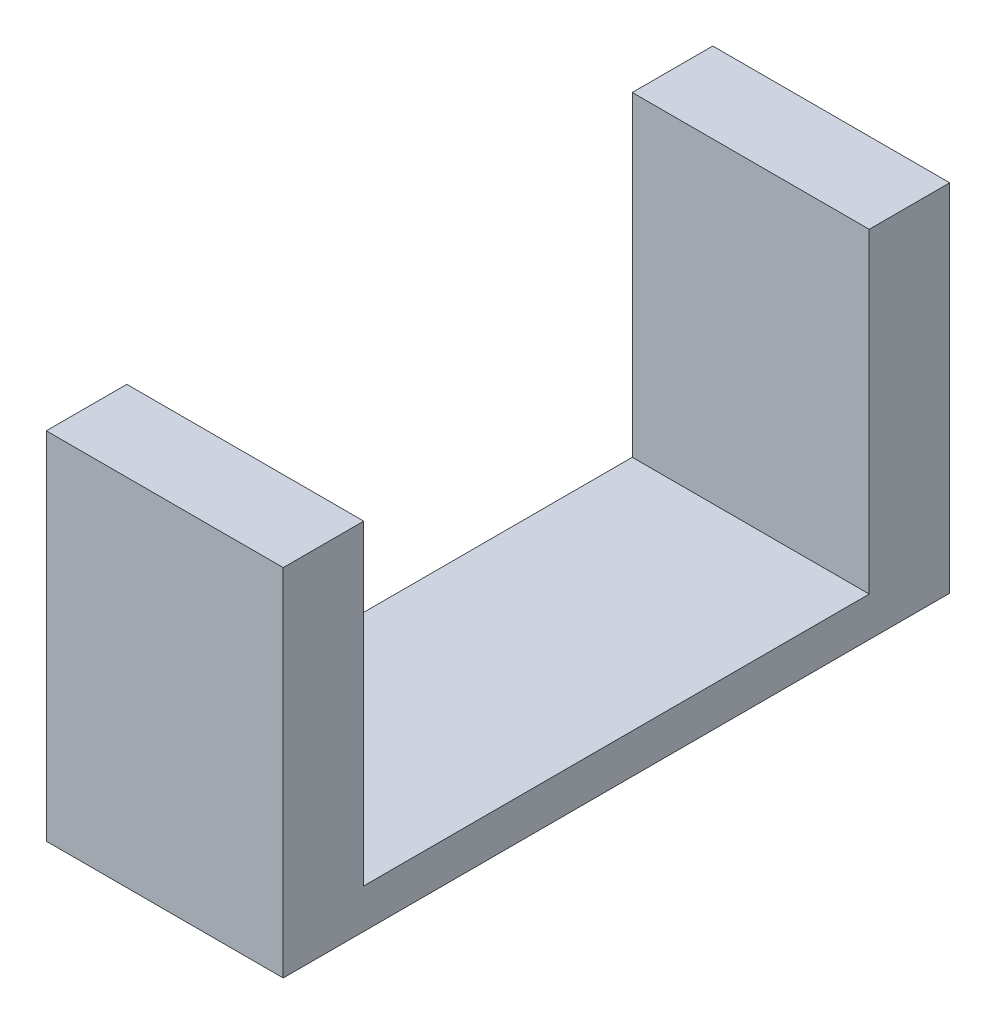
ISO-10303-21;
HEADER;
FILE_DESCRIPTION(('STEP AP214'),'2;1');
FILE_NAME('part.step','',(''),(''),'','','');
FILE_SCHEMA(('AUTOMOTIVE_DESIGN { 1 0 10303 214 1 1 1 1 }'));
ENDSEC;
DATA;
#1=APPLICATION_CONTEXT('core data for automotive mechanical design processes');
#2=APPLICATION_PROTOCOL_DEFINITION('international standard','automotive_design',2000,#1);
#3=PRODUCT_CONTEXT('',#1,'mechanical');
#4=PRODUCT('Part','Part','',(#3));
#5=PRODUCT_RELATED_PRODUCT_CATEGORY('part','',(#4));
#6=PRODUCT_DEFINITION_FORMATION('','',#4);
#7=PRODUCT_DEFINITION_CONTEXT('part definition',#1,'design');
#8=PRODUCT_DEFINITION('design','',#6,#7);
#9=PRODUCT_DEFINITION_SHAPE('','',#8);
#10=(LENGTH_UNIT() NAMED_UNIT(*) SI_UNIT(.MILLI.,.METRE.));
#11=(NAMED_UNIT(*) PLANE_ANGLE_UNIT() SI_UNIT($,.RADIAN.));
#12=(NAMED_UNIT(*) SI_UNIT($,.STERADIAN.) SOLID_ANGLE_UNIT());
#13=UNCERTAINTY_MEASURE_WITH_UNIT(LENGTH_MEASURE(1.E-05),#10,'distance_accuracy_value','');
#14=(GEOMETRIC_REPRESENTATION_CONTEXT(3) GLOBAL_UNCERTAINTY_ASSIGNED_CONTEXT((#13)) GLOBAL_UNIT_ASSIGNED_CONTEXT((#10,
#11,#12)) REPRESENTATION_CONTEXT('',''));
#15=CARTESIAN_POINT('',(0.,0.,0.));
#16=DIRECTION('',(0.,0.,1.));
#17=DIRECTION('',(1.,0.,0.));
#18=AXIS2_PLACEMENT_3D('',#15,#16,#17);
#19=CARTESIAN_POINT('',(0.,3.175,0.));
#20=DIRECTION('',(0.,1.,0.));
#21=DIRECTION('',(0.,0.,1.));
#22=AXIS2_PLACEMENT_3D('',#19,#20,#21);
#23=PLANE('',#22);
#24=DIRECTION('',(-1.,0.,0.));
#25=VECTOR('',#24,1.);
#26=CARTESIAN_POINT('',(0.,3.175,20.32));
#27=LINE('',#26,#25);
#28=CARTESIAN_POINT('',(9.525,3.17500000000001,20.32));
#29=VERTEX_POINT('',#28);
#30=CARTESIAN_POINT('',(-9.525,3.175,20.32));
#31=VERTEX_POINT('',#30);
#32=EDGE_CURVE('E114',#29,#31,#27,.T.);
#33=ORIENTED_EDGE('',*,*,#32,.F.);
#34=DIRECTION('',(0.,0.,-1.));
#35=VECTOR('',#34,1.);
#36=CARTESIAN_POINT('',(9.525,3.175,0.));
#37=LINE('',#36,#35);
#38=CARTESIAN_POINT('',(9.52500000000001,3.17500000000001,-20.32));
#39=VERTEX_POINT('',#38);
#40=EDGE_CURVE('E172',#29,#39,#37,.T.);
#41=ORIENTED_EDGE('',*,*,#40,.T.);
#42=DIRECTION('',(-1.,0.,0.));
#43=VECTOR('',#42,1.);
#44=CARTESIAN_POINT('',(0.,3.175,-20.32));
#45=LINE('',#44,#43);
#46=CARTESIAN_POINT('',(-9.52500000000001,3.17500000000001,-20.32));
#47=VERTEX_POINT('',#46);
#48=EDGE_CURVE('E167',#39,#47,#45,.T.);
#49=ORIENTED_EDGE('',*,*,#48,.T.);
#50=DIRECTION('',(0.,0.,-1.));
#51=VECTOR('',#50,1.);
#52=CARTESIAN_POINT('',(-9.525,3.175,0.));
#53=LINE('',#52,#51);
#54=EDGE_CURVE('E57',#31,#47,#53,.T.);
#55=ORIENTED_EDGE('',*,*,#54,.F.);
#56=EDGE_LOOP('',(#33,#41,#49,#55));
#57=FACE_BOUND('',#56,.T.);
#58=ADVANCED_FACE('F41',(#57),#23,.T.);
#59=CARTESIAN_POINT('',(-9.525,3.175,0.));
#60=DIRECTION('',(-1.,0.,0.));
#61=DIRECTION('',(0.,0.,1.));
#62=AXIS2_PLACEMENT_3D('',#59,#60,#61);
#63=PLANE('',#62);
#64=DIRECTION('',(0.,-1.,0.));
#65=VECTOR('',#64,1.);
#66=CARTESIAN_POINT('',(-9.525,3.175,-26.7920525238256));
#67=LINE('',#66,#65);
#68=CARTESIAN_POINT('',(-9.525,28.575,-26.7920525238256));
#69=VERTEX_POINT('',#68);
#70=CARTESIAN_POINT('',(-9.525,0.,-26.7920525238256));
#71=VERTEX_POINT('',#70);
#72=EDGE_CURVE('E176',#69,#71,#67,.T.);
#73=ORIENTED_EDGE('',*,*,#72,.T.);
#74=DIRECTION('',(0.,0.,-1.));
#75=VECTOR('',#74,1.);
#76=CARTESIAN_POINT('',(-9.525,0.,0.));
#77=LINE('',#76,#75);
#78=CARTESIAN_POINT('',(-9.525,0.,26.7920525238256));
#79=VERTEX_POINT('',#78);
#80=EDGE_CURVE('E65',#79,#71,#77,.T.);
#81=ORIENTED_EDGE('',*,*,#80,.F.);
#82=DIRECTION('',(0.,-1.,0.));
#83=VECTOR('',#82,1.);
#84=CARTESIAN_POINT('',(-9.525,3.175,26.7920525238256));
#85=LINE('',#84,#83);
#86=CARTESIAN_POINT('',(-9.525,28.575,26.7920525238256));
#87=VERTEX_POINT('',#86);
#88=EDGE_CURVE('E11',#87,#79,#85,.T.);
#89=ORIENTED_EDGE('',*,*,#88,.F.);
#90=DIRECTION('',(0.,0.,-1.));
#91=VECTOR('',#90,1.);
#92=CARTESIAN_POINT('',(-9.525,28.575,0.));
#93=LINE('',#92,#91);
#94=CARTESIAN_POINT('',(-9.525,28.575,20.32));
#95=VERTEX_POINT('',#94);
#96=EDGE_CURVE('E124',#87,#95,#93,.T.);
#97=ORIENTED_EDGE('',*,*,#96,.T.);
#98=DIRECTION('',(0.,-1.,0.));
#99=VECTOR('',#98,1.);
#100=CARTESIAN_POINT('',(-9.525,28.575,20.32));
#101=LINE('',#100,#99);
#102=EDGE_CURVE('E109',#95,#31,#101,.T.);
#103=ORIENTED_EDGE('',*,*,#102,.T.);
#104=ORIENTED_EDGE('',*,*,#54,.T.);
#105=DIRECTION('',(0.,-1.,0.));
#106=VECTOR('',#105,1.);
#107=CARTESIAN_POINT('',(-9.52500000000001,28.575,-20.32));
#108=LINE('',#107,#106);
#109=CARTESIAN_POINT('',(-9.52500000000001,28.575,-20.32));
#110=VERTEX_POINT('',#109);
#111=EDGE_CURVE('E159',#110,#47,#108,.T.);
#112=ORIENTED_EDGE('',*,*,#111,.F.);
#113=DIRECTION('',(0.,0.,-1.));
#114=VECTOR('',#113,1.);
#115=CARTESIAN_POINT('',(-9.525,28.575,0.));
#116=LINE('',#115,#114);
#117=EDGE_CURVE('E155',#110,#69,#116,.T.);
#118=ORIENTED_EDGE('',*,*,#117,.T.);
#119=EDGE_LOOP('',(#73,#81,#89,#97,#103,#104,#112,#118));
#120=FACE_BOUND('',#119,.T.);
#121=ADVANCED_FACE('F43',(#120),#63,.T.);
#122=CARTESIAN_POINT('',(0.,3.175,26.7920525238256));
#123=DIRECTION('',(0.,0.,-1.));
#124=DIRECTION('',(-1.,0.,0.));
#125=AXIS2_PLACEMENT_3D('',#122,#123,#124);
#126=PLANE('',#125);
#127=DIRECTION('',(1.,0.,0.));
#128=VECTOR('',#127,1.);
#129=CARTESIAN_POINT('',(0.,0.,26.7920525238256));
#130=LINE('',#129,#128);
#131=CARTESIAN_POINT('',(9.525,0.,26.7920525238256));
#132=VERTEX_POINT('',#131);
#133=EDGE_CURVE('E179',#79,#132,#130,.T.);
#134=ORIENTED_EDGE('',*,*,#133,.T.);
#135=DIRECTION('',(0.,-1.,0.));
#136=VECTOR('',#135,1.);
#137=CARTESIAN_POINT('',(9.525,3.175,26.7920525238256));
#138=LINE('',#137,#136);
#139=CARTESIAN_POINT('',(9.525,28.575,26.7920525238256));
#140=VERTEX_POINT('',#139);
#141=EDGE_CURVE('E50',#140,#132,#138,.T.);
#142=ORIENTED_EDGE('',*,*,#141,.F.);
#143=DIRECTION('',(1.,0.,0.));
#144=VECTOR('',#143,1.);
#145=CARTESIAN_POINT('',(0.,28.575,26.7920525238256));
#146=LINE('',#145,#144);
#147=EDGE_CURVE('E132',#87,#140,#146,.T.);
#148=ORIENTED_EDGE('',*,*,#147,.F.);
#149=ORIENTED_EDGE('',*,*,#88,.T.);
#150=EDGE_LOOP('',(#134,#142,#148,#149));
#151=FACE_BOUND('',#150,.T.);
#152=ADVANCED_FACE('F216',(#151),#126,.F.);
#153=CARTESIAN_POINT('',(9.525,3.175,0.));
#154=DIRECTION('',(-1.,0.,0.));
#155=DIRECTION('',(0.,0.,1.));
#156=AXIS2_PLACEMENT_3D('',#153,#154,#155);
#157=PLANE('',#156);
#158=ORIENTED_EDGE('',*,*,#40,.F.);
#159=DIRECTION('',(0.,-1.,0.));
#160=VECTOR('',#159,1.);
#161=CARTESIAN_POINT('',(9.525,28.575,20.32));
#162=LINE('',#161,#160);
#163=CARTESIAN_POINT('',(9.525,28.575,20.32));
#164=VERTEX_POINT('',#163);
#165=EDGE_CURVE('E118',#164,#29,#162,.T.);
#166=ORIENTED_EDGE('',*,*,#165,.F.);
#167=DIRECTION('',(0.,0.,-1.));
#168=VECTOR('',#167,1.);
#169=CARTESIAN_POINT('',(9.525,28.575,0.));
#170=LINE('',#169,#168);
#171=EDGE_CURVE('E126',#140,#164,#170,.T.);
#172=ORIENTED_EDGE('',*,*,#171,.F.);
#173=ORIENTED_EDGE('',*,*,#141,.T.);
#174=DIRECTION('',(0.,0.,-1.));
#175=VECTOR('',#174,1.);
#176=CARTESIAN_POINT('',(9.525,0.,0.));
#177=LINE('',#176,#175);
#178=CARTESIAN_POINT('',(9.525,0.,-26.7920525238256));
#179=VERTEX_POINT('',#178);
#180=EDGE_CURVE('E182',#132,#179,#177,.T.);
#181=ORIENTED_EDGE('',*,*,#180,.T.);
#182=DIRECTION('',(0.,-1.,0.));
#183=VECTOR('',#182,1.);
#184=CARTESIAN_POINT('',(9.525,3.175,-26.7920525238256));
#185=LINE('',#184,#183);
#186=CARTESIAN_POINT('',(9.525,28.575,-26.7920525238256));
#187=VERTEX_POINT('',#186);
#188=EDGE_CURVE('E189',#187,#179,#185,.T.);
#189=ORIENTED_EDGE('',*,*,#188,.F.);
#190=DIRECTION('',(0.,0.,-1.));
#191=VECTOR('',#190,1.);
#192=CARTESIAN_POINT('',(9.525,28.575,0.));
#193=LINE('',#192,#191);
#194=CARTESIAN_POINT('',(9.52500000000001,28.575,-20.32));
#195=VERTEX_POINT('',#194);
#196=EDGE_CURVE('E147',#195,#187,#193,.T.);
#197=ORIENTED_EDGE('',*,*,#196,.F.);
#198=DIRECTION('',(0.,-1.,0.));
#199=VECTOR('',#198,1.);
#200=CARTESIAN_POINT('',(9.52500000000001,28.575,-20.32));
#201=LINE('',#200,#199);
#202=EDGE_CURVE('E163',#195,#39,#201,.T.);
#203=ORIENTED_EDGE('',*,*,#202,.T.);
#204=EDGE_LOOP('',(#158,#166,#172,#173,#181,#189,#197,#203));
#205=FACE_BOUND('',#204,.T.);
#206=ADVANCED_FACE('F196',(#205),#157,.F.);
#207=CARTESIAN_POINT('',(0.,3.175,-26.7920525238256));
#208=DIRECTION('',(0.,0.,-1.));
#209=DIRECTION('',(-1.,0.,0.));
#210=AXIS2_PLACEMENT_3D('',#207,#208,#209);
#211=PLANE('',#210);
#212=DIRECTION('',(1.,0.,0.));
#213=VECTOR('',#212,1.);
#214=CARTESIAN_POINT('',(0.,0.,-26.7920525238256));
#215=LINE('',#214,#213);
#216=EDGE_CURVE('E173',#71,#179,#215,.T.);
#217=ORIENTED_EDGE('',*,*,#216,.F.);
#218=ORIENTED_EDGE('',*,*,#72,.F.);
#219=DIRECTION('',(1.,0.,0.));
#220=VECTOR('',#219,1.);
#221=CARTESIAN_POINT('',(0.,28.575,-26.7920525238256));
#222=LINE('',#221,#220);
#223=EDGE_CURVE('E151',#69,#187,#222,.T.);
#224=ORIENTED_EDGE('',*,*,#223,.T.);
#225=ORIENTED_EDGE('',*,*,#188,.T.);
#226=EDGE_LOOP('',(#217,#218,#224,#225));
#227=FACE_BOUND('',#226,.T.);
#228=ADVANCED_FACE('F201',(#227),#211,.T.);
#229=CARTESIAN_POINT('',(0.,0.,0.));
#230=DIRECTION('',(0.,1.,0.));
#231=DIRECTION('',(0.,0.,1.));
#232=AXIS2_PLACEMENT_3D('',#229,#230,#231);
#233=PLANE('',#232);
#234=ORIENTED_EDGE('',*,*,#216,.T.);
#235=ORIENTED_EDGE('',*,*,#180,.F.);
#236=ORIENTED_EDGE('',*,*,#133,.F.);
#237=ORIENTED_EDGE('',*,*,#80,.T.);
#238=EDGE_LOOP('',(#234,#235,#236,#237));
#239=FACE_BOUND('',#238,.T.);
#240=ADVANCED_FACE('F198',(#239),#233,.F.);
#241=CARTESIAN_POINT('',(0.,28.575,-20.32));
#242=DIRECTION('',(0.,0.,-1.));
#243=DIRECTION('',(-1.,0.,0.));
#244=AXIS2_PLACEMENT_3D('',#241,#242,#243);
#245=PLANE('',#244);
#246=ORIENTED_EDGE('',*,*,#48,.F.);
#247=ORIENTED_EDGE('',*,*,#202,.F.);
#248=DIRECTION('',(1.,0.,0.));
#249=VECTOR('',#248,1.);
#250=CARTESIAN_POINT('',(0.,28.575,-20.32));
#251=LINE('',#250,#249);
#252=EDGE_CURVE('E143',#110,#195,#251,.T.);
#253=ORIENTED_EDGE('',*,*,#252,.F.);
#254=ORIENTED_EDGE('',*,*,#111,.T.);
#255=EDGE_LOOP('',(#246,#247,#253,#254));
#256=FACE_BOUND('',#255,.T.);
#257=ADVANCED_FACE('F210',(#256),#245,.F.);
#258=CARTESIAN_POINT('',(0.,28.575,0.));
#259=DIRECTION('',(0.,1.,0.));
#260=DIRECTION('',(0.,0.,1.));
#261=AXIS2_PLACEMENT_3D('',#258,#259,#260);
#262=PLANE('',#261);
#263=ORIENTED_EDGE('',*,*,#252,.T.);
#264=ORIENTED_EDGE('',*,*,#196,.T.);
#265=ORIENTED_EDGE('',*,*,#223,.F.);
#266=ORIENTED_EDGE('',*,*,#117,.F.);
#267=EDGE_LOOP('',(#263,#264,#265,#266));
#268=FACE_BOUND('',#267,.T.);
#269=ADVANCED_FACE('F204',(#268),#262,.T.);
#270=CARTESIAN_POINT('',(0.,28.575,20.32));
#271=DIRECTION('',(0.,0.,-1.));
#272=DIRECTION('',(-1.,0.,0.));
#273=AXIS2_PLACEMENT_3D('',#270,#271,#272);
#274=PLANE('',#273);
#275=ORIENTED_EDGE('',*,*,#165,.T.);
#276=ORIENTED_EDGE('',*,*,#32,.T.);
#277=ORIENTED_EDGE('',*,*,#102,.F.);
#278=DIRECTION('',(1.,0.,0.));
#279=VECTOR('',#278,1.);
#280=CARTESIAN_POINT('',(0.,28.575,20.32));
#281=LINE('',#280,#279);
#282=EDGE_CURVE('E113',#95,#164,#281,.T.);
#283=ORIENTED_EDGE('',*,*,#282,.T.);
#284=EDGE_LOOP('',(#275,#276,#277,#283));
#285=FACE_BOUND('',#284,.T.);
#286=ADVANCED_FACE('F112',(#285),#274,.T.);
#287=CARTESIAN_POINT('',(0.,28.575,0.));
#288=DIRECTION('',(0.,1.,0.));
#289=DIRECTION('',(0.,0.,1.));
#290=AXIS2_PLACEMENT_3D('',#287,#288,#289);
#291=PLANE('',#290);
#292=ORIENTED_EDGE('',*,*,#282,.F.);
#293=ORIENTED_EDGE('',*,*,#96,.F.);
#294=ORIENTED_EDGE('',*,*,#147,.T.);
#295=ORIENTED_EDGE('',*,*,#171,.T.);
#296=EDGE_LOOP('',(#292,#293,#294,#295));
#297=FACE_BOUND('',#296,.T.);
#298=ADVANCED_FACE('F122',(#297),#291,.T.);
#299=CLOSED_SHELL('',(#58,#121,#152,#206,#228,#240,#257,#269,#286,#298));
#300=MANIFOLD_SOLID_BREP('B2',#299);
#301=ADVANCED_BREP_SHAPE_REPRESENTATION('',(#18,#300),#14);
#302=SHAPE_DEFINITION_REPRESENTATION(#9,#301);
ENDSEC;
END-ISO-10303-21;
